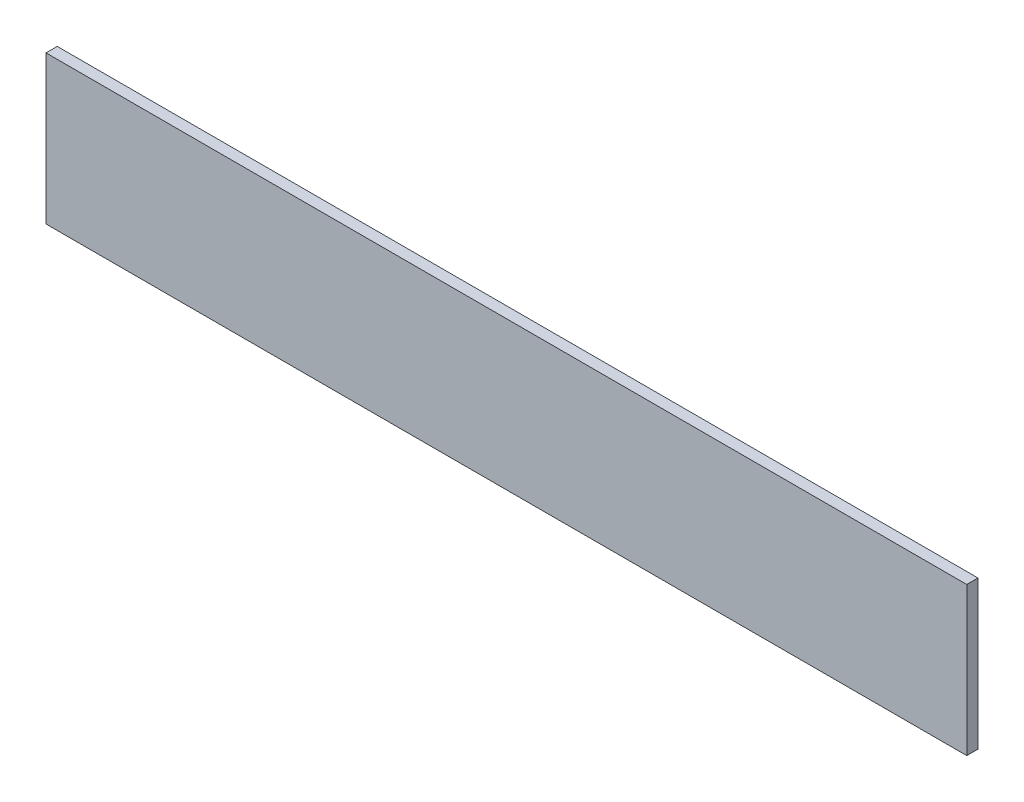
ISO-10303-21;
HEADER;
FILE_DESCRIPTION(('STEP AP214'),'2;1');
FILE_NAME('part.step','',(''),(''),'','','');
FILE_SCHEMA(('AUTOMOTIVE_DESIGN { 1 0 10303 214 1 1 1 1 }'));
ENDSEC;
DATA;
#1=APPLICATION_CONTEXT('core data for automotive mechanical design processes');
#2=APPLICATION_PROTOCOL_DEFINITION('international standard','automotive_design',2000,#1);
#3=PRODUCT_CONTEXT('',#1,'mechanical');
#4=PRODUCT('Part','Part','',(#3));
#5=PRODUCT_RELATED_PRODUCT_CATEGORY('part','',(#4));
#6=PRODUCT_DEFINITION_FORMATION('','',#4);
#7=PRODUCT_DEFINITION_CONTEXT('part definition',#1,'design');
#8=PRODUCT_DEFINITION('design','',#6,#7);
#9=PRODUCT_DEFINITION_SHAPE('','',#8);
#10=(LENGTH_UNIT() NAMED_UNIT(*) SI_UNIT(.MILLI.,.METRE.));
#11=(NAMED_UNIT(*) PLANE_ANGLE_UNIT() SI_UNIT($,.RADIAN.));
#12=(NAMED_UNIT(*) SI_UNIT($,.STERADIAN.) SOLID_ANGLE_UNIT());
#13=UNCERTAINTY_MEASURE_WITH_UNIT(LENGTH_MEASURE(1.E-05),#10,'distance_accuracy_value','');
#14=(GEOMETRIC_REPRESENTATION_CONTEXT(3) GLOBAL_UNCERTAINTY_ASSIGNED_CONTEXT((#13)) GLOBAL_UNIT_ASSIGNED_CONTEXT((#10,
#11,#12)) REPRESENTATION_CONTEXT('',''));
#15=CARTESIAN_POINT('',(0.,0.,0.));
#16=DIRECTION('',(0.,0.,1.));
#17=DIRECTION('',(1.,0.,0.));
#18=AXIS2_PLACEMENT_3D('',#15,#16,#17);
#19=CARTESIAN_POINT('',(205.,33.,5.));
#20=DIRECTION('',(-1.,0.,0.));
#21=DIRECTION('',(0.,0.,1.));
#22=AXIS2_PLACEMENT_3D('',#19,#20,#21);
#23=PLANE('',#22);
#24=DIRECTION('',(0.,1.,0.));
#25=VECTOR('',#24,1.);
#26=CARTESIAN_POINT('',(205.,33.,0.));
#27=LINE('',#26,#25);
#28=CARTESIAN_POINT('',(205.,-33.,0.));
#29=VERTEX_POINT('',#28);
#30=CARTESIAN_POINT('',(205.,33.,0.));
#31=VERTEX_POINT('',#30);
#32=EDGE_CURVE('E107',#29,#31,#27,.T.);
#33=ORIENTED_EDGE('',*,*,#32,.T.);
#34=DIRECTION('',(0.,0.,-1.));
#35=VECTOR('',#34,1.);
#36=CARTESIAN_POINT('',(205.,33.,5.));
#37=LINE('',#36,#35);
#38=CARTESIAN_POINT('',(205.,33.,5.));
#39=VERTEX_POINT('',#38);
#40=EDGE_CURVE('E11',#39,#31,#37,.T.);
#41=ORIENTED_EDGE('',*,*,#40,.F.);
#42=DIRECTION('',(0.,1.,0.));
#43=VECTOR('',#42,1.);
#44=CARTESIAN_POINT('',(205.,33.,5.));
#45=LINE('',#44,#43);
#46=CARTESIAN_POINT('',(205.,-33.,5.));
#47=VERTEX_POINT('',#46);
#48=EDGE_CURVE('E91',#47,#39,#45,.T.);
#49=ORIENTED_EDGE('',*,*,#48,.F.);
#50=DIRECTION('',(0.,0.,-1.));
#51=VECTOR('',#50,1.);
#52=CARTESIAN_POINT('',(205.,-33.,5.));
#53=LINE('',#52,#51);
#54=EDGE_CURVE('E103',#47,#29,#53,.T.);
#55=ORIENTED_EDGE('',*,*,#54,.T.);
#56=EDGE_LOOP('',(#33,#41,#49,#55));
#57=FACE_BOUND('',#56,.T.);
#58=ADVANCED_FACE('F39',(#57),#23,.F.);
#59=CARTESIAN_POINT('',(-205.,33.,5.));
#60=DIRECTION('',(0.,-1.,0.));
#61=DIRECTION('',(0.,0.,-1.));
#62=AXIS2_PLACEMENT_3D('',#59,#60,#61);
#63=PLANE('',#62);
#64=DIRECTION('',(-1.,0.,0.));
#65=VECTOR('',#64,1.);
#66=CARTESIAN_POINT('',(-205.,33.,0.));
#67=LINE('',#66,#65);
#68=CARTESIAN_POINT('',(-205.,33.,0.));
#69=VERTEX_POINT('',#68);
#70=EDGE_CURVE('E96',#31,#69,#67,.T.);
#71=ORIENTED_EDGE('',*,*,#70,.T.);
#72=DIRECTION('',(0.,0.,-1.));
#73=VECTOR('',#72,1.);
#74=CARTESIAN_POINT('',(-205.,33.,5.));
#75=LINE('',#74,#73);
#76=CARTESIAN_POINT('',(-205.,33.,5.));
#77=VERTEX_POINT('',#76);
#78=EDGE_CURVE('E48',#77,#69,#75,.T.);
#79=ORIENTED_EDGE('',*,*,#78,.F.);
#80=DIRECTION('',(-1.,0.,0.));
#81=VECTOR('',#80,1.);
#82=CARTESIAN_POINT('',(-205.,33.,5.));
#83=LINE('',#82,#81);
#84=EDGE_CURVE('E86',#39,#77,#83,.T.);
#85=ORIENTED_EDGE('',*,*,#84,.F.);
#86=ORIENTED_EDGE('',*,*,#40,.T.);
#87=EDGE_LOOP('',(#71,#79,#85,#86));
#88=FACE_BOUND('',#87,.T.);
#89=ADVANCED_FACE('F95',(#88),#63,.F.);
#90=CARTESIAN_POINT('',(-205.,33.,5.));
#91=DIRECTION('',(1.,0.,0.));
#92=DIRECTION('',(0.,0.,-1.));
#93=AXIS2_PLACEMENT_3D('',#90,#91,#92);
#94=PLANE('',#93);
#95=DIRECTION('',(0.,-1.,0.));
#96=VECTOR('',#95,1.);
#97=CARTESIAN_POINT('',(-205.,33.,0.));
#98=LINE('',#97,#96);
#99=CARTESIAN_POINT('',(-205.,-33.,0.));
#100=VERTEX_POINT('',#99);
#101=EDGE_CURVE('E73',#69,#100,#98,.T.);
#102=ORIENTED_EDGE('',*,*,#101,.T.);
#103=DIRECTION('',(0.,0.,-1.));
#104=VECTOR('',#103,1.);
#105=CARTESIAN_POINT('',(-205.,-33.,5.));
#106=LINE('',#105,#104);
#107=CARTESIAN_POINT('',(-205.,-33.,5.));
#108=VERTEX_POINT('',#107);
#109=EDGE_CURVE('E98',#108,#100,#106,.T.);
#110=ORIENTED_EDGE('',*,*,#109,.F.);
#111=DIRECTION('',(0.,-1.,0.));
#112=VECTOR('',#111,1.);
#113=CARTESIAN_POINT('',(-205.,33.,5.));
#114=LINE('',#113,#112);
#115=EDGE_CURVE('E89',#77,#108,#114,.T.);
#116=ORIENTED_EDGE('',*,*,#115,.F.);
#117=ORIENTED_EDGE('',*,*,#78,.T.);
#118=EDGE_LOOP('',(#102,#110,#116,#117));
#119=FACE_BOUND('',#118,.T.);
#120=ADVANCED_FACE('F99',(#119),#94,.F.);
#121=CARTESIAN_POINT('',(-205.,-33.,5.));
#122=DIRECTION('',(0.,1.,0.));
#123=DIRECTION('',(0.,0.,1.));
#124=AXIS2_PLACEMENT_3D('',#121,#122,#123);
#125=PLANE('',#124);
#126=DIRECTION('',(1.,0.,0.));
#127=VECTOR('',#126,1.);
#128=CARTESIAN_POINT('',(-205.,-33.,0.));
#129=LINE('',#128,#127);
#130=EDGE_CURVE('E79',#100,#29,#129,.T.);
#131=ORIENTED_EDGE('',*,*,#130,.T.);
#132=ORIENTED_EDGE('',*,*,#54,.F.);
#133=DIRECTION('',(1.,0.,0.));
#134=VECTOR('',#133,1.);
#135=CARTESIAN_POINT('',(-205.,-33.,5.));
#136=LINE('',#135,#134);
#137=EDGE_CURVE('E56',#108,#47,#136,.T.);
#138=ORIENTED_EDGE('',*,*,#137,.F.);
#139=ORIENTED_EDGE('',*,*,#109,.T.);
#140=EDGE_LOOP('',(#131,#132,#138,#139));
#141=FACE_BOUND('',#140,.T.);
#142=ADVANCED_FACE('F120',(#141),#125,.F.);
#143=CARTESIAN_POINT('',(0.,0.,5.));
#144=DIRECTION('',(0.,0.,1.));
#145=DIRECTION('',(1.,0.,0.));
#146=AXIS2_PLACEMENT_3D('',#143,#144,#145);
#147=PLANE('',#146);
#148=ORIENTED_EDGE('',*,*,#48,.T.);
#149=ORIENTED_EDGE('',*,*,#84,.T.);
#150=ORIENTED_EDGE('',*,*,#115,.T.);
#151=ORIENTED_EDGE('',*,*,#137,.T.);
#152=EDGE_LOOP('',(#148,#149,#150,#151));
#153=FACE_BOUND('',#152,.T.);
#154=ADVANCED_FACE('F87',(#153),#147,.T.);
#155=CARTESIAN_POINT('',(0.,0.,0.));
#156=DIRECTION('',(0.,0.,1.));
#157=DIRECTION('',(1.,0.,0.));
#158=AXIS2_PLACEMENT_3D('',#155,#156,#157);
#159=PLANE('',#158);
#160=ORIENTED_EDGE('',*,*,#32,.F.);
#161=ORIENTED_EDGE('',*,*,#130,.F.);
#162=ORIENTED_EDGE('',*,*,#101,.F.);
#163=ORIENTED_EDGE('',*,*,#70,.F.);
#164=EDGE_LOOP('',(#160,#161,#162,#163));
#165=FACE_BOUND('',#164,.T.);
#166=ADVANCED_FACE('F123',(#165),#159,.F.);
#167=CLOSED_SHELL('',(#58,#89,#120,#142,#154,#166));
#168=MANIFOLD_SOLID_BREP('B2',#167);
#169=ADVANCED_BREP_SHAPE_REPRESENTATION('',(#18,#168),#14);
#170=SHAPE_DEFINITION_REPRESENTATION(#9,#169);
ENDSEC;
END-ISO-10303-21;
